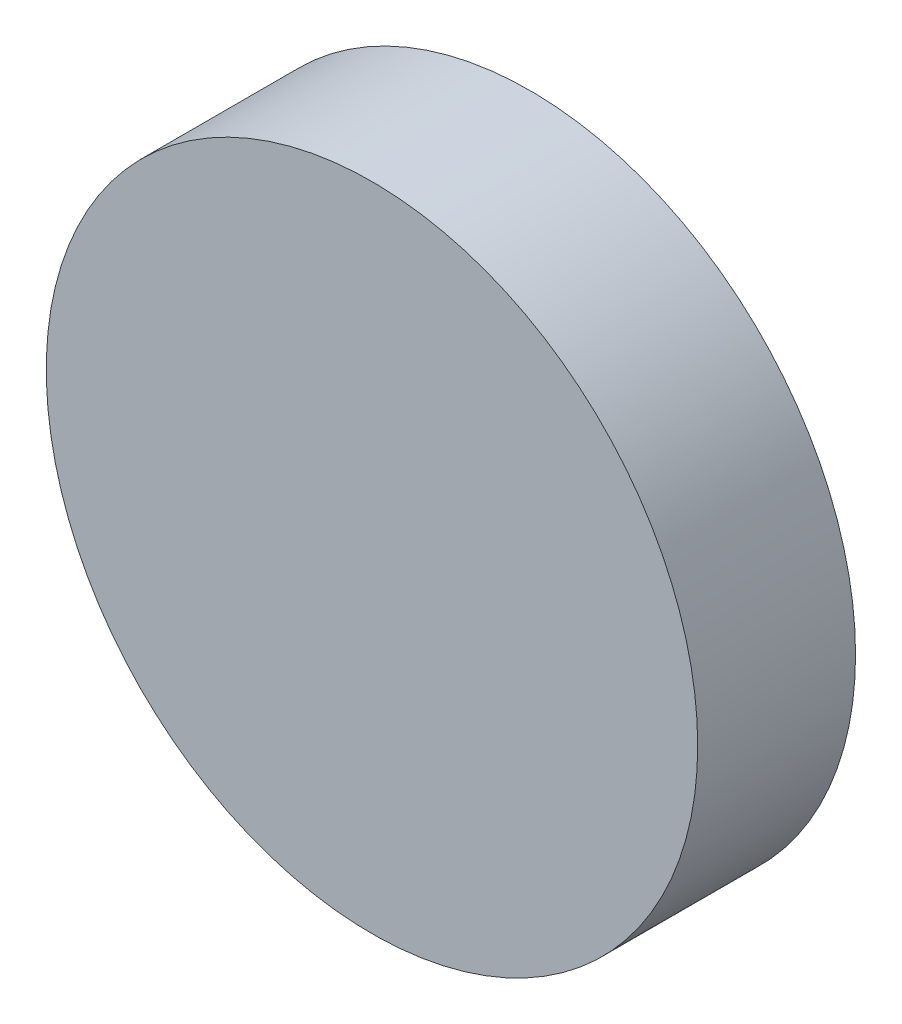
ISO-10303-21;
HEADER;
FILE_DESCRIPTION(('STEP AP214'),'2;1');
FILE_NAME('part.step','',(''),(''),'','','');
FILE_SCHEMA(('AUTOMOTIVE_DESIGN { 1 0 10303 214 1 1 1 1 }'));
ENDSEC;
DATA;
#1=APPLICATION_CONTEXT('core data for automotive mechanical design processes');
#2=APPLICATION_PROTOCOL_DEFINITION('international standard','automotive_design',2000,#1);
#3=PRODUCT_CONTEXT('',#1,'mechanical');
#4=PRODUCT('Part','Part','',(#3));
#5=PRODUCT_RELATED_PRODUCT_CATEGORY('part','',(#4));
#6=PRODUCT_DEFINITION_FORMATION('','',#4);
#7=PRODUCT_DEFINITION_CONTEXT('part definition',#1,'design');
#8=PRODUCT_DEFINITION('design','',#6,#7);
#9=PRODUCT_DEFINITION_SHAPE('','',#8);
#10=(LENGTH_UNIT() NAMED_UNIT(*) SI_UNIT(.MILLI.,.METRE.));
#11=(NAMED_UNIT(*) PLANE_ANGLE_UNIT() SI_UNIT($,.RADIAN.));
#12=(NAMED_UNIT(*) SI_UNIT($,.STERADIAN.) SOLID_ANGLE_UNIT());
#13=UNCERTAINTY_MEASURE_WITH_UNIT(LENGTH_MEASURE(1.E-05),#10,'distance_accuracy_value','');
#14=(GEOMETRIC_REPRESENTATION_CONTEXT(3) GLOBAL_UNCERTAINTY_ASSIGNED_CONTEXT((#13)) GLOBAL_UNIT_ASSIGNED_CONTEXT((#10,
#11,#12)) REPRESENTATION_CONTEXT('',''));
#15=CARTESIAN_POINT('',(0.,0.,0.));
#16=DIRECTION('',(0.,0.,1.));
#17=DIRECTION('',(1.,0.,0.));
#18=AXIS2_PLACEMENT_3D('',#15,#16,#17);
#19=CARTESIAN_POINT('',(41.5,31.275,20.));
#20=DIRECTION('',(0.,0.,-1.));
#21=DIRECTION('',(-1.,0.,0.));
#22=AXIS2_PLACEMENT_3D('',#19,#20,#21);
#23=CYLINDRICAL_SURFACE('',#22,41.275);
#24=CARTESIAN_POINT('',(41.5,31.275,20.));
#25=DIRECTION('',(0.,0.,1.));
#26=DIRECTION('',(1.,0.,0.));
#27=AXIS2_PLACEMENT_3D('',#24,#25,#26);
#28=CIRCLE('',#27,41.275);
#29=CARTESIAN_POINT('',(82.775,31.275,20.));
#30=VERTEX_POINT('',#29);
#31=EDGE_CURVE('E10',#30,#30,#28,.T.);
#32=ORIENTED_EDGE('',*,*,#31,.F.);
#33=EDGE_LOOP('',(#32));
#34=FACE_BOUND('',#33,.T.);
#35=CARTESIAN_POINT('',(41.5,31.275,0.));
#36=DIRECTION('',(0.,0.,1.));
#37=DIRECTION('',(1.,0.,0.));
#38=AXIS2_PLACEMENT_3D('',#35,#36,#37);
#39=CIRCLE('',#38,41.275);
#40=CARTESIAN_POINT('',(82.775,31.275,0.));
#41=VERTEX_POINT('',#40);
#42=EDGE_CURVE('E31',#41,#41,#39,.T.);
#43=ORIENTED_EDGE('',*,*,#42,.T.);
#44=EDGE_LOOP('',(#43));
#45=FACE_BOUND('',#44,.T.);
#46=ADVANCED_FACE('F28',(#34,#45),#23,.T.);
#47=CARTESIAN_POINT('',(41.5,31.275,20.));
#48=DIRECTION('',(0.,0.,1.));
#49=DIRECTION('',(1.,0.,0.));
#50=AXIS2_PLACEMENT_3D('',#47,#48,#49);
#51=PLANE('',#50);
#52=ORIENTED_EDGE('',*,*,#31,.T.);
#53=EDGE_LOOP('',(#52));
#54=FACE_BOUND('',#53,.T.);
#55=ADVANCED_FACE('F43',(#54),#51,.T.);
#56=CARTESIAN_POINT('',(41.5,31.275,0.));
#57=DIRECTION('',(0.,0.,1.));
#58=DIRECTION('',(1.,0.,0.));
#59=AXIS2_PLACEMENT_3D('',#56,#57,#58);
#60=PLANE('',#59);
#61=ORIENTED_EDGE('',*,*,#42,.F.);
#62=EDGE_LOOP('',(#61));
#63=FACE_BOUND('',#62,.T.);
#64=ADVANCED_FACE('F41',(#63),#60,.F.);
#65=CLOSED_SHELL('',(#46,#55,#64));
#66=MANIFOLD_SOLID_BREP('B2',#65);
#67=ADVANCED_BREP_SHAPE_REPRESENTATION('',(#18,#66),#14);
#68=SHAPE_DEFINITION_REPRESENTATION(#9,#67);
ENDSEC;
END-ISO-10303-21;
